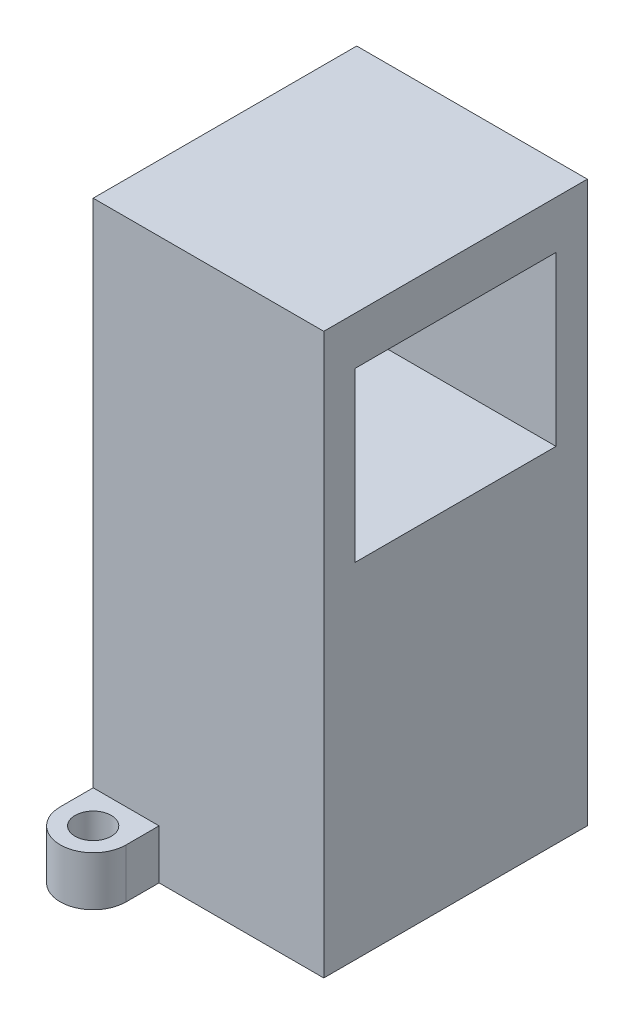
ISO-10303-21;
HEADER;
FILE_DESCRIPTION(('STEP AP214'),'2;1');
FILE_NAME('part.step','',(''),(''),'','','');
FILE_SCHEMA(('AUTOMOTIVE_DESIGN { 1 0 10303 214 1 1 1 1 }'));
ENDSEC;
DATA;
#1=APPLICATION_CONTEXT('core data for automotive mechanical design processes');
#2=APPLICATION_PROTOCOL_DEFINITION('international standard','automotive_design',2000,#1);
#3=PRODUCT_CONTEXT('',#1,'mechanical');
#4=PRODUCT('Part','Part','',(#3));
#5=PRODUCT_RELATED_PRODUCT_CATEGORY('part','',(#4));
#6=PRODUCT_DEFINITION_FORMATION('','',#4);
#7=PRODUCT_DEFINITION_CONTEXT('part definition',#1,'design');
#8=PRODUCT_DEFINITION('design','',#6,#7);
#9=PRODUCT_DEFINITION_SHAPE('','',#8);
#10=(LENGTH_UNIT() NAMED_UNIT(*) SI_UNIT(.MILLI.,.METRE.));
#11=(NAMED_UNIT(*) PLANE_ANGLE_UNIT() SI_UNIT($,.RADIAN.));
#12=(NAMED_UNIT(*) SI_UNIT($,.STERADIAN.) SOLID_ANGLE_UNIT());
#13=UNCERTAINTY_MEASURE_WITH_UNIT(LENGTH_MEASURE(1.E-05),#10,'distance_accuracy_value','');
#14=(GEOMETRIC_REPRESENTATION_CONTEXT(3) GLOBAL_UNCERTAINTY_ASSIGNED_CONTEXT((#13)) GLOBAL_UNIT_ASSIGNED_CONTEXT((#10,
#11,#12)) REPRESENTATION_CONTEXT('',''));
#15=CARTESIAN_POINT('',(0.,0.,0.));
#16=DIRECTION('',(0.,0.,1.));
#17=DIRECTION('',(1.,0.,0.));
#18=AXIS2_PLACEMENT_3D('',#15,#16,#17);
#19=CARTESIAN_POINT('',(-7.,34.,-8.));
#20=DIRECTION('',(0.,0.,1.));
#21=DIRECTION('',(1.,0.,0.));
#22=AXIS2_PLACEMENT_3D('',#19,#20,#21);
#23=PLANE('',#22);
#24=DIRECTION('',(0.,-1.,0.));
#25=VECTOR('',#24,1.);
#26=CARTESIAN_POINT('',(-3.,3.,-8.));
#27=LINE('',#26,#25);
#28=CARTESIAN_POINT('',(-3.,3.,-8.));
#29=VERTEX_POINT('',#28);
#30=CARTESIAN_POINT('',(-3.,0.,-8.));
#31=VERTEX_POINT('',#30);
#32=EDGE_CURVE('E222',#29,#31,#27,.T.);
#33=ORIENTED_EDGE('',*,*,#32,.F.);
#34=DIRECTION('',(1.,0.,0.));
#35=VECTOR('',#34,1.);
#36=CARTESIAN_POINT('',(-3.,3.,-8.));
#37=LINE('',#36,#35);
#38=CARTESIAN_POINT('',(-7.,3.,-8.));
#39=VERTEX_POINT('',#38);
#40=EDGE_CURVE('E64',#39,#29,#37,.T.);
#41=ORIENTED_EDGE('',*,*,#40,.F.);
#42=DIRECTION('',(0.,-1.,0.));
#43=VECTOR('',#42,1.);
#44=CARTESIAN_POINT('',(-7.,34.,-8.));
#45=LINE('',#44,#43);
#46=CARTESIAN_POINT('',(-7.,34.,-8.));
#47=VERTEX_POINT('',#46);
#48=EDGE_CURVE('E49',#47,#39,#45,.T.);
#49=ORIENTED_EDGE('',*,*,#48,.F.);
#50=DIRECTION('',(-1.,0.,0.));
#51=VECTOR('',#50,1.);
#52=CARTESIAN_POINT('',(-7.,34.,-8.));
#53=LINE('',#52,#51);
#54=CARTESIAN_POINT('',(7.,34.,-8.));
#55=VERTEX_POINT('',#54);
#56=EDGE_CURVE('E187',#55,#47,#53,.T.);
#57=ORIENTED_EDGE('',*,*,#56,.F.);
#58=DIRECTION('',(0.,-1.,0.));
#59=VECTOR('',#58,1.);
#60=CARTESIAN_POINT('',(7.,34.,-8.));
#61=LINE('',#60,#59);
#62=CARTESIAN_POINT('',(7.,0.,-8.));
#63=VERTEX_POINT('',#62);
#64=EDGE_CURVE('E11',#55,#63,#61,.T.);
#65=ORIENTED_EDGE('',*,*,#64,.T.);
#66=DIRECTION('',(-1.,0.,0.));
#67=VECTOR('',#66,1.);
#68=CARTESIAN_POINT('',(-7.,0.,-8.));
#69=LINE('',#68,#67);
#70=EDGE_CURVE('E178',#63,#31,#69,.T.);
#71=ORIENTED_EDGE('',*,*,#70,.T.);
#72=EDGE_LOOP('',(#33,#41,#49,#57,#65,#71));
#73=FACE_BOUND('',#72,.T.);
#74=ADVANCED_FACE('F41',(#73),#23,.F.);
#75=CARTESIAN_POINT('',(7.,34.,-8.));
#76=DIRECTION('',(-1.,0.,0.));
#77=DIRECTION('',(0.,0.,1.));
#78=AXIS2_PLACEMENT_3D('',#75,#76,#77);
#79=PLANE('',#78);
#80=DIRECTION('',(0.,0.,1.));
#81=VECTOR('',#80,1.);
#82=CARTESIAN_POINT('',(7.00000000000001,31.1,6.1));
#83=LINE('',#82,#81);
#84=CARTESIAN_POINT('',(7.,31.1,-6.1));
#85=VERTEX_POINT('',#84);
#86=CARTESIAN_POINT('',(7.00000000000001,31.1,6.1));
#87=VERTEX_POINT('',#86);
#88=EDGE_CURVE('E217',#85,#87,#83,.T.);
#89=ORIENTED_EDGE('',*,*,#88,.F.);
#90=DIRECTION('',(0.,1.,0.));
#91=VECTOR('',#90,1.);
#92=CARTESIAN_POINT('',(7.00000000000001,31.1,-6.1));
#93=LINE('',#92,#91);
#94=CARTESIAN_POINT('',(7.00000000000001,20.9,-6.1));
#95=VERTEX_POINT('',#94);
#96=EDGE_CURVE('E220',#95,#85,#93,.T.);
#97=ORIENTED_EDGE('',*,*,#96,.F.);
#98=DIRECTION('',(0.,0.,-1.));
#99=VECTOR('',#98,1.);
#100=CARTESIAN_POINT('',(7.00000000000001,20.9,6.1));
#101=LINE('',#100,#99);
#102=CARTESIAN_POINT('',(7.00000000000001,20.9,6.1));
#103=VERTEX_POINT('',#102);
#104=EDGE_CURVE('E211',#103,#95,#101,.T.);
#105=ORIENTED_EDGE('',*,*,#104,.F.);
#106=DIRECTION('',(0.,-1.,0.));
#107=VECTOR('',#106,1.);
#108=CARTESIAN_POINT('',(7.00000000000001,31.1,6.1));
#109=LINE('',#108,#107);
#110=EDGE_CURVE('E214',#87,#103,#109,.T.);
#111=ORIENTED_EDGE('',*,*,#110,.F.);
#112=EDGE_LOOP('',(#89,#97,#105,#111));
#113=FACE_BOUND('',#112,.T.);
#114=DIRECTION('',(0.,0.,-1.));
#115=VECTOR('',#114,1.);
#116=CARTESIAN_POINT('',(7.,0.,-8.));
#117=LINE('',#116,#115);
#118=CARTESIAN_POINT('',(7.00000000000001,0.,8.));
#119=VERTEX_POINT('',#118);
#120=EDGE_CURVE('E180',#119,#63,#117,.T.);
#121=ORIENTED_EDGE('',*,*,#120,.T.);
#122=ORIENTED_EDGE('',*,*,#64,.F.);
#123=DIRECTION('',(0.,0.,-1.));
#124=VECTOR('',#123,1.);
#125=CARTESIAN_POINT('',(7.,34.,-8.));
#126=LINE('',#125,#124);
#127=CARTESIAN_POINT('',(7.00000000000001,34.,8.));
#128=VERTEX_POINT('',#127);
#129=EDGE_CURVE('E175',#128,#55,#126,.T.);
#130=ORIENTED_EDGE('',*,*,#129,.F.);
#131=DIRECTION('',(0.,-1.,0.));
#132=VECTOR('',#131,1.);
#133=CARTESIAN_POINT('',(7.00000000000001,34.,8.));
#134=LINE('',#133,#132);
#135=EDGE_CURVE('E168',#128,#119,#134,.T.);
#136=ORIENTED_EDGE('',*,*,#135,.T.);
#137=EDGE_LOOP('',(#121,#122,#130,#136));
#138=FACE_BOUND('',#137,.T.);
#139=ADVANCED_FACE('F43',(#113,#138),#79,.F.);
#140=CARTESIAN_POINT('',(-7.,34.,-8.));
#141=DIRECTION('',(1.,0.,0.));
#142=DIRECTION('',(0.,0.,-1.));
#143=AXIS2_PLACEMENT_3D('',#140,#141,#142);
#144=PLANE('',#143);
#145=DIRECTION('',(0.,0.,-1.));
#146=VECTOR('',#145,1.);
#147=CARTESIAN_POINT('',(-7.,20.9,6.1));
#148=LINE('',#147,#146);
#149=CARTESIAN_POINT('',(-7.,20.9,6.1));
#150=VERTEX_POINT('',#149);
#151=CARTESIAN_POINT('',(-7.,20.9,-6.1));
#152=VERTEX_POINT('',#151);
#153=EDGE_CURVE('E195',#150,#152,#148,.T.);
#154=ORIENTED_EDGE('',*,*,#153,.T.);
#155=DIRECTION('',(0.,1.,0.));
#156=VECTOR('',#155,1.);
#157=CARTESIAN_POINT('',(-7.,31.1,-6.1));
#158=LINE('',#157,#156);
#159=CARTESIAN_POINT('',(-7.,31.1,-6.1));
#160=VERTEX_POINT('',#159);
#161=EDGE_CURVE('E208',#152,#160,#158,.T.);
#162=ORIENTED_EDGE('',*,*,#161,.T.);
#163=DIRECTION('',(0.,0.,1.));
#164=VECTOR('',#163,1.);
#165=CARTESIAN_POINT('',(-7.,31.1,6.1));
#166=LINE('',#165,#164);
#167=CARTESIAN_POINT('',(-7.,31.1,6.1));
#168=VERTEX_POINT('',#167);
#169=EDGE_CURVE('E205',#160,#168,#166,.T.);
#170=ORIENTED_EDGE('',*,*,#169,.T.);
#171=DIRECTION('',(0.,-1.,0.));
#172=VECTOR('',#171,1.);
#173=CARTESIAN_POINT('',(-7.,31.1,6.1));
#174=LINE('',#173,#172);
#175=EDGE_CURVE('E202',#168,#150,#174,.T.);
#176=ORIENTED_EDGE('',*,*,#175,.T.);
#177=EDGE_LOOP('',(#154,#162,#170,#176));
#178=FACE_BOUND('',#177,.T.);
#179=DIRECTION('',(0.,0.,1.));
#180=VECTOR('',#179,1.);
#181=CARTESIAN_POINT('',(-7.,0.,-8.));
#182=LINE('',#181,#180);
#183=CARTESIAN_POINT('',(-7.,0.,-10.));
#184=VERTEX_POINT('',#183);
#185=CARTESIAN_POINT('',(-7.,0.,10.));
#186=VERTEX_POINT('',#185);
#187=EDGE_CURVE('E176',#184,#186,#182,.T.);
#188=ORIENTED_EDGE('',*,*,#187,.T.);
#189=DIRECTION('',(0.,-1.,0.));
#190=VECTOR('',#189,1.);
#191=CARTESIAN_POINT('',(-7.,3.,10.));
#192=LINE('',#191,#190);
#193=CARTESIAN_POINT('',(-7.,3.,10.));
#194=VERTEX_POINT('',#193);
#195=EDGE_CURVE('E162',#194,#186,#192,.T.);
#196=ORIENTED_EDGE('',*,*,#195,.F.);
#197=DIRECTION('',(0.,0.,-1.));
#198=VECTOR('',#197,1.);
#199=CARTESIAN_POINT('',(-7.,3.,8.));
#200=LINE('',#199,#198);
#201=CARTESIAN_POINT('',(-7.,3.,8.));
#202=VERTEX_POINT('',#201);
#203=EDGE_CURVE('E148',#194,#202,#200,.T.);
#204=ORIENTED_EDGE('',*,*,#203,.T.);
#205=DIRECTION('',(0.,-1.,0.));
#206=VECTOR('',#205,1.);
#207=CARTESIAN_POINT('',(-6.99999999999999,34.,8.));
#208=LINE('',#207,#206);
#209=CARTESIAN_POINT('',(-6.99999999999999,34.,8.));
#210=VERTEX_POINT('',#209);
#211=EDGE_CURVE('E159',#210,#202,#208,.T.);
#212=ORIENTED_EDGE('',*,*,#211,.F.);
#213=DIRECTION('',(0.,0.,1.));
#214=VECTOR('',#213,1.);
#215=CARTESIAN_POINT('',(-7.,34.,-8.));
#216=LINE('',#215,#214);
#217=EDGE_CURVE('E185',#47,#210,#216,.T.);
#218=ORIENTED_EDGE('',*,*,#217,.F.);
#219=ORIENTED_EDGE('',*,*,#48,.T.);
#220=DIRECTION('',(0.,0.,1.));
#221=VECTOR('',#220,1.);
#222=CARTESIAN_POINT('',(-7.,3.,-8.));
#223=LINE('',#222,#221);
#224=CARTESIAN_POINT('',(-7.,3.,-10.));
#225=VERTEX_POINT('',#224);
#226=EDGE_CURVE('E231',#225,#39,#223,.T.);
#227=ORIENTED_EDGE('',*,*,#226,.F.);
#228=DIRECTION('',(0.,-1.,0.));
#229=VECTOR('',#228,1.);
#230=CARTESIAN_POINT('',(-7.,3.,-10.));
#231=LINE('',#230,#229);
#232=EDGE_CURVE('E228',#225,#184,#231,.T.);
#233=ORIENTED_EDGE('',*,*,#232,.T.);
#234=EDGE_LOOP('',(#188,#196,#204,#212,#218,#219,#227,#233));
#235=FACE_BOUND('',#234,.T.);
#236=ADVANCED_FACE('F157',(#178,#235),#144,.F.);
#237=CARTESIAN_POINT('',(-6.99999999999999,34.,8.));
#238=DIRECTION('',(0.,0.,-1.));
#239=DIRECTION('',(-1.,0.,0.));
#240=AXIS2_PLACEMENT_3D('',#237,#238,#239);
#241=PLANE('',#240);
#242=ORIENTED_EDGE('',*,*,#211,.T.);
#243=DIRECTION('',(1.,0.,0.));
#244=VECTOR('',#243,1.);
#245=CARTESIAN_POINT('',(-3.,3.,8.));
#246=LINE('',#245,#244);
#247=CARTESIAN_POINT('',(-3.,3.,8.));
#248=VERTEX_POINT('',#247);
#249=EDGE_CURVE('E144',#202,#248,#246,.T.);
#250=ORIENTED_EDGE('',*,*,#249,.T.);
#251=DIRECTION('',(0.,-1.,0.));
#252=VECTOR('',#251,1.);
#253=CARTESIAN_POINT('',(-3.,3.,8.));
#254=LINE('',#253,#252);
#255=CARTESIAN_POINT('',(-3.,0.,8.));
#256=VERTEX_POINT('',#255);
#257=EDGE_CURVE('E253',#248,#256,#254,.T.);
#258=ORIENTED_EDGE('',*,*,#257,.T.);
#259=DIRECTION('',(1.,0.,0.));
#260=VECTOR('',#259,1.);
#261=CARTESIAN_POINT('',(-6.99999999999999,0.,8.));
#262=LINE('',#261,#260);
#263=EDGE_CURVE('E173',#256,#119,#262,.T.);
#264=ORIENTED_EDGE('',*,*,#263,.T.);
#265=ORIENTED_EDGE('',*,*,#135,.F.);
#266=DIRECTION('',(1.,0.,0.));
#267=VECTOR('',#266,1.);
#268=CARTESIAN_POINT('',(-6.99999999999999,34.,8.));
#269=LINE('',#268,#267);
#270=EDGE_CURVE('E167',#210,#128,#269,.T.);
#271=ORIENTED_EDGE('',*,*,#270,.F.);
#272=EDGE_LOOP('',(#242,#250,#258,#264,#265,#271));
#273=FACE_BOUND('',#272,.T.);
#274=ADVANCED_FACE('F165',(#273),#241,.F.);
#275=CARTESIAN_POINT('',(0.,34.,0.));
#276=DIRECTION('',(0.,1.,0.));
#277=DIRECTION('',(0.,0.,1.));
#278=AXIS2_PLACEMENT_3D('',#275,#276,#277);
#279=PLANE('',#278);
#280=ORIENTED_EDGE('',*,*,#129,.T.);
#281=ORIENTED_EDGE('',*,*,#56,.T.);
#282=ORIENTED_EDGE('',*,*,#217,.T.);
#283=ORIENTED_EDGE('',*,*,#270,.T.);
#284=EDGE_LOOP('',(#280,#281,#282,#283));
#285=FACE_BOUND('',#284,.T.);
#286=ADVANCED_FACE('F278',(#285),#279,.T.);
#287=CARTESIAN_POINT('',(0.,0.,0.));
#288=DIRECTION('',(0.,1.,0.));
#289=DIRECTION('',(0.,0.,1.));
#290=AXIS2_PLACEMENT_3D('',#287,#288,#289);
#291=PLANE('',#290);
#292=ORIENTED_EDGE('',*,*,#120,.F.);
#293=ORIENTED_EDGE('',*,*,#263,.F.);
#294=DIRECTION('',(0.,0.,1.));
#295=VECTOR('',#294,1.);
#296=CARTESIAN_POINT('',(-3.,0.,10.));
#297=LINE('',#296,#295);
#298=CARTESIAN_POINT('',(-3.,0.,10.));
#299=VERTEX_POINT('',#298);
#300=EDGE_CURVE('E56',#256,#299,#297,.T.);
#301=ORIENTED_EDGE('',*,*,#300,.T.);
#302=CARTESIAN_POINT('',(-5.,0.,10.));
#303=DIRECTION('',(0.,-1.,0.));
#304=DIRECTION('',(0.,0.,-1.));
#305=AXIS2_PLACEMENT_3D('',#302,#303,#304);
#306=CIRCLE('',#305,2.);
#307=EDGE_CURVE('E256',#299,#186,#306,.T.);
#308=ORIENTED_EDGE('',*,*,#307,.T.);
#309=ORIENTED_EDGE('',*,*,#187,.F.);
#310=CARTESIAN_POINT('',(-5.,0.,-10.));
#311=DIRECTION('',(0.,1.,0.));
#312=DIRECTION('',(0.,0.,1.));
#313=AXIS2_PLACEMENT_3D('',#310,#311,#312);
#314=CIRCLE('',#313,2.);
#315=CARTESIAN_POINT('',(-3.,0.,-10.));
#316=VERTEX_POINT('',#315);
#317=EDGE_CURVE('E232',#316,#184,#314,.T.);
#318=ORIENTED_EDGE('',*,*,#317,.F.);
#319=DIRECTION('',(0.,0.,-1.));
#320=VECTOR('',#319,1.);
#321=CARTESIAN_POINT('',(-3.,0.,-10.));
#322=LINE('',#321,#320);
#323=EDGE_CURVE('E235',#31,#316,#322,.T.);
#324=ORIENTED_EDGE('',*,*,#323,.F.);
#325=ORIENTED_EDGE('',*,*,#70,.F.);
#326=EDGE_LOOP('',(#292,#293,#301,#308,#309,#318,#324,#325));
#327=FACE_BOUND('',#326,.T.);
#328=CARTESIAN_POINT('',(-5.,0.,-10.));
#329=DIRECTION('',(0.,1.,0.));
#330=DIRECTION('',(0.,0.,1.));
#331=AXIS2_PLACEMENT_3D('',#328,#329,#330);
#332=CIRCLE('',#331,1.1);
#333=CARTESIAN_POINT('',(-5.,0.,-8.9));
#334=VERTEX_POINT('',#333);
#335=EDGE_CURVE('E245',#334,#334,#332,.T.);
#336=ORIENTED_EDGE('',*,*,#335,.T.);
#337=EDGE_LOOP('',(#336));
#338=FACE_BOUND('',#337,.T.);
#339=CARTESIAN_POINT('',(-5.,0.,10.));
#340=DIRECTION('',(0.,-1.,0.));
#341=DIRECTION('',(0.,0.,-1.));
#342=AXIS2_PLACEMENT_3D('',#339,#340,#341);
#343=CIRCLE('',#342,1.1);
#344=CARTESIAN_POINT('',(-5.,0.,8.9));
#345=VERTEX_POINT('',#344);
#346=EDGE_CURVE('E262',#345,#345,#343,.T.);
#347=ORIENTED_EDGE('',*,*,#346,.F.);
#348=EDGE_LOOP('',(#347));
#349=FACE_BOUND('',#348,.T.);
#350=ADVANCED_FACE('F275',(#327,#338,#349),#291,.F.);
#351=CARTESIAN_POINT('',(-7.,31.1,-6.1));
#352=DIRECTION('',(0.,0.,-1.));
#353=DIRECTION('',(0.,1.,0.));
#354=AXIS2_PLACEMENT_3D('',#351,#352,#353);
#355=PLANE('',#354);
#356=DIRECTION('',(1.,0.,0.));
#357=VECTOR('',#356,1.);
#358=CARTESIAN_POINT('',(-7.,31.1,-6.1));
#359=LINE('',#358,#357);
#360=EDGE_CURVE('E191',#160,#85,#359,.T.);
#361=ORIENTED_EDGE('',*,*,#360,.F.);
#362=ORIENTED_EDGE('',*,*,#161,.F.);
#363=DIRECTION('',(1.,0.,0.));
#364=VECTOR('',#363,1.);
#365=CARTESIAN_POINT('',(-7.,20.9,-6.1));
#366=LINE('',#365,#364);
#367=EDGE_CURVE('E183',#152,#95,#366,.T.);
#368=ORIENTED_EDGE('',*,*,#367,.T.);
#369=ORIENTED_EDGE('',*,*,#96,.T.);
#370=EDGE_LOOP('',(#361,#362,#368,#369));
#371=FACE_BOUND('',#370,.T.);
#372=ADVANCED_FACE('F277',(#371),#355,.F.);
#373=CARTESIAN_POINT('',(-7.,20.9,6.1));
#374=DIRECTION('',(0.,-1.,0.));
#375=DIRECTION('',(0.,0.,-1.));
#376=AXIS2_PLACEMENT_3D('',#373,#374,#375);
#377=PLANE('',#376);
#378=ORIENTED_EDGE('',*,*,#367,.F.);
#379=ORIENTED_EDGE('',*,*,#153,.F.);
#380=DIRECTION('',(1.,0.,0.));
#381=VECTOR('',#380,1.);
#382=CARTESIAN_POINT('',(-7.,20.9,6.1));
#383=LINE('',#382,#381);
#384=EDGE_CURVE('E197',#150,#103,#383,.T.);
#385=ORIENTED_EDGE('',*,*,#384,.T.);
#386=ORIENTED_EDGE('',*,*,#104,.T.);
#387=EDGE_LOOP('',(#378,#379,#385,#386));
#388=FACE_BOUND('',#387,.T.);
#389=ADVANCED_FACE('F285',(#388),#377,.F.);
#390=CARTESIAN_POINT('',(-7.,31.1,6.1));
#391=DIRECTION('',(0.,0.,1.));
#392=DIRECTION('',(0.,-1.,0.));
#393=AXIS2_PLACEMENT_3D('',#390,#391,#392);
#394=PLANE('',#393);
#395=ORIENTED_EDGE('',*,*,#384,.F.);
#396=ORIENTED_EDGE('',*,*,#175,.F.);
#397=DIRECTION('',(1.,0.,0.));
#398=VECTOR('',#397,1.);
#399=CARTESIAN_POINT('',(-7.,31.1,6.1));
#400=LINE('',#399,#398);
#401=EDGE_CURVE('E194',#168,#87,#400,.T.);
#402=ORIENTED_EDGE('',*,*,#401,.T.);
#403=ORIENTED_EDGE('',*,*,#110,.T.);
#404=EDGE_LOOP('',(#395,#396,#402,#403));
#405=FACE_BOUND('',#404,.T.);
#406=ADVANCED_FACE('F333',(#405),#394,.F.);
#407=CARTESIAN_POINT('',(-7.,31.1,6.1));
#408=DIRECTION('',(0.,1.,0.));
#409=DIRECTION('',(0.,0.,1.));
#410=AXIS2_PLACEMENT_3D('',#407,#408,#409);
#411=PLANE('',#410);
#412=ORIENTED_EDGE('',*,*,#401,.F.);
#413=ORIENTED_EDGE('',*,*,#169,.F.);
#414=ORIENTED_EDGE('',*,*,#360,.T.);
#415=ORIENTED_EDGE('',*,*,#88,.T.);
#416=EDGE_LOOP('',(#412,#413,#414,#415));
#417=FACE_BOUND('',#416,.T.);
#418=ADVANCED_FACE('F343',(#417),#411,.F.);
#419=CARTESIAN_POINT('',(-5.,3.,-10.));
#420=DIRECTION('',(0.,1.,0.));
#421=DIRECTION('',(0.,0.,1.));
#422=AXIS2_PLACEMENT_3D('',#419,#420,#421);
#423=PLANE('',#422);
#424=ORIENTED_EDGE('',*,*,#40,.T.);
#425=DIRECTION('',(0.,0.,-1.));
#426=VECTOR('',#425,1.);
#427=CARTESIAN_POINT('',(-3.,3.,-10.));
#428=LINE('',#427,#426);
#429=CARTESIAN_POINT('',(-3.,3.,-10.));
#430=VERTEX_POINT('',#429);
#431=EDGE_CURVE('E242',#29,#430,#428,.T.);
#432=ORIENTED_EDGE('',*,*,#431,.T.);
#433=CARTESIAN_POINT('',(-5.,3.,-10.));
#434=DIRECTION('',(0.,1.,0.));
#435=DIRECTION('',(0.,0.,1.));
#436=AXIS2_PLACEMENT_3D('',#433,#434,#435);
#437=CIRCLE('',#436,2.);
#438=EDGE_CURVE('E240',#430,#225,#437,.T.);
#439=ORIENTED_EDGE('',*,*,#438,.T.);
#440=ORIENTED_EDGE('',*,*,#226,.T.);
#441=EDGE_LOOP('',(#424,#432,#439,#440));
#442=FACE_BOUND('',#441,.T.);
#443=CARTESIAN_POINT('',(-5.,3.,-10.));
#444=DIRECTION('',(0.,1.,0.));
#445=DIRECTION('',(0.,0.,1.));
#446=AXIS2_PLACEMENT_3D('',#443,#444,#445);
#447=CIRCLE('',#446,1.1);
#448=CARTESIAN_POINT('',(-5.,3.,-8.9));
#449=VERTEX_POINT('',#448);
#450=EDGE_CURVE('E237',#449,#449,#447,.T.);
#451=ORIENTED_EDGE('',*,*,#450,.F.);
#452=EDGE_LOOP('',(#451));
#453=FACE_BOUND('',#452,.T.);
#454=ADVANCED_FACE('F352',(#442,#453),#423,.T.);
#455=CARTESIAN_POINT('',(-3.,3.,-10.));
#456=DIRECTION('',(-1.,0.,0.));
#457=DIRECTION('',(0.,0.,1.));
#458=AXIS2_PLACEMENT_3D('',#455,#456,#457);
#459=PLANE('',#458);
#460=ORIENTED_EDGE('',*,*,#323,.T.);
#461=DIRECTION('',(0.,-1.,0.));
#462=VECTOR('',#461,1.);
#463=CARTESIAN_POINT('',(-3.,3.,-10.));
#464=LINE('',#463,#462);
#465=EDGE_CURVE('E225',#430,#316,#464,.T.);
#466=ORIENTED_EDGE('',*,*,#465,.F.);
#467=ORIENTED_EDGE('',*,*,#431,.F.);
#468=ORIENTED_EDGE('',*,*,#32,.T.);
#469=EDGE_LOOP('',(#460,#466,#467,#468));
#470=FACE_BOUND('',#469,.T.);
#471=ADVANCED_FACE('F368',(#470),#459,.F.);
#472=CARTESIAN_POINT('',(-5.,3.,-10.));
#473=DIRECTION('',(0.,-1.,0.));
#474=DIRECTION('',(0.,0.,-1.));
#475=AXIS2_PLACEMENT_3D('',#472,#473,#474);
#476=CYLINDRICAL_SURFACE('',#475,2.);
#477=ORIENTED_EDGE('',*,*,#317,.T.);
#478=ORIENTED_EDGE('',*,*,#232,.F.);
#479=ORIENTED_EDGE('',*,*,#438,.F.);
#480=ORIENTED_EDGE('',*,*,#465,.T.);
#481=EDGE_LOOP('',(#477,#478,#479,#480));
#482=FACE_BOUND('',#481,.T.);
#483=ADVANCED_FACE('F380',(#482),#476,.T.);
#484=CARTESIAN_POINT('',(-5.,3.,-10.));
#485=DIRECTION('',(0.,-1.,0.));
#486=DIRECTION('',(0.,0.,-1.));
#487=AXIS2_PLACEMENT_3D('',#484,#485,#486);
#488=CYLINDRICAL_SURFACE('',#487,1.1);
#489=ORIENTED_EDGE('',*,*,#450,.T.);
#490=EDGE_LOOP('',(#489));
#491=FACE_BOUND('',#490,.T.);
#492=ORIENTED_EDGE('',*,*,#335,.F.);
#493=EDGE_LOOP('',(#492));
#494=FACE_BOUND('',#493,.T.);
#495=ADVANCED_FACE('F391',(#491,#494),#488,.F.);
#496=CARTESIAN_POINT('',(-5.,3.,10.));
#497=DIRECTION('',(0.,-1.,0.));
#498=DIRECTION('',(0.,0.,-1.));
#499=AXIS2_PLACEMENT_3D('',#496,#497,#498);
#500=CYLINDRICAL_SURFACE('',#499,2.);
#501=ORIENTED_EDGE('',*,*,#307,.F.);
#502=DIRECTION('',(0.,-1.,0.));
#503=VECTOR('',#502,1.);
#504=CARTESIAN_POINT('',(-3.,3.,10.));
#505=LINE('',#504,#503);
#506=CARTESIAN_POINT('',(-3.,3.,10.));
#507=VERTEX_POINT('',#506);
#508=EDGE_CURVE('E251',#507,#299,#505,.T.);
#509=ORIENTED_EDGE('',*,*,#508,.F.);
#510=CARTESIAN_POINT('',(-5.,3.,10.));
#511=DIRECTION('',(0.,-1.,0.));
#512=DIRECTION('',(0.,0.,-1.));
#513=AXIS2_PLACEMENT_3D('',#510,#511,#512);
#514=CIRCLE('',#513,2.);
#515=EDGE_CURVE('E163',#507,#194,#514,.T.);
#516=ORIENTED_EDGE('',*,*,#515,.T.);
#517=ORIENTED_EDGE('',*,*,#195,.T.);
#518=EDGE_LOOP('',(#501,#509,#516,#517));
#519=FACE_BOUND('',#518,.T.);
#520=ADVANCED_FACE('F401',(#519),#500,.T.);
#521=CARTESIAN_POINT('',(-3.,3.,10.));
#522=DIRECTION('',(1.,0.,0.));
#523=DIRECTION('',(0.,0.,-1.));
#524=AXIS2_PLACEMENT_3D('',#521,#522,#523);
#525=PLANE('',#524);
#526=ORIENTED_EDGE('',*,*,#300,.F.);
#527=ORIENTED_EDGE('',*,*,#257,.F.);
#528=DIRECTION('',(0.,0.,1.));
#529=VECTOR('',#528,1.);
#530=CARTESIAN_POINT('',(-3.,3.,10.));
#531=LINE('',#530,#529);
#532=EDGE_CURVE('E151',#248,#507,#531,.T.);
#533=ORIENTED_EDGE('',*,*,#532,.T.);
#534=ORIENTED_EDGE('',*,*,#508,.T.);
#535=EDGE_LOOP('',(#526,#527,#533,#534));
#536=FACE_BOUND('',#535,.T.);
#537=ADVANCED_FACE('F429',(#536),#525,.T.);
#538=CARTESIAN_POINT('',(-5.,3.,10.));
#539=DIRECTION('',(0.,1.,0.));
#540=DIRECTION('',(0.,0.,-1.));
#541=AXIS2_PLACEMENT_3D('',#538,#539,#540);
#542=PLANE('',#541);
#543=CARTESIAN_POINT('',(-5.,3.,10.));
#544=DIRECTION('',(0.,-1.,0.));
#545=DIRECTION('',(0.,0.,-1.));
#546=AXIS2_PLACEMENT_3D('',#543,#544,#545);
#547=CIRCLE('',#546,1.1);
#548=CARTESIAN_POINT('',(-5.,3.,8.9));
#549=VERTEX_POINT('',#548);
#550=EDGE_CURVE('E259',#549,#549,#547,.T.);
#551=ORIENTED_EDGE('',*,*,#550,.T.);
#552=EDGE_LOOP('',(#551));
#553=FACE_BOUND('',#552,.T.);
#554=ORIENTED_EDGE('',*,*,#249,.F.);
#555=ORIENTED_EDGE('',*,*,#203,.F.);
#556=ORIENTED_EDGE('',*,*,#515,.F.);
#557=ORIENTED_EDGE('',*,*,#532,.F.);
#558=EDGE_LOOP('',(#554,#555,#556,#557));
#559=FACE_BOUND('',#558,.T.);
#560=ADVANCED_FACE('F146',(#553,#559),#542,.T.);
#561=CARTESIAN_POINT('',(-5.,3.,10.));
#562=DIRECTION('',(0.,-1.,0.));
#563=DIRECTION('',(0.,0.,-1.));
#564=AXIS2_PLACEMENT_3D('',#561,#562,#563);
#565=CYLINDRICAL_SURFACE('',#564,1.1);
#566=ORIENTED_EDGE('',*,*,#550,.F.);
#567=EDGE_LOOP('',(#566));
#568=FACE_BOUND('',#567,.T.);
#569=ORIENTED_EDGE('',*,*,#346,.T.);
#570=EDGE_LOOP('',(#569));
#571=FACE_BOUND('',#570,.T.);
#572=ADVANCED_FACE('F269',(#568,#571),#565,.F.);
#573=CLOSED_SHELL('',(#74,#139,#236,#274,#286,#350,#372,#389,#406,#418,#454,#471,#483,#495,#520,
#537,#560,#572));
#574=MANIFOLD_SOLID_BREP('B2',#573);
#575=ADVANCED_BREP_SHAPE_REPRESENTATION('',(#18,#574),#14);
#576=SHAPE_DEFINITION_REPRESENTATION(#9,#575);
ENDSEC;
END-ISO-10303-21;
